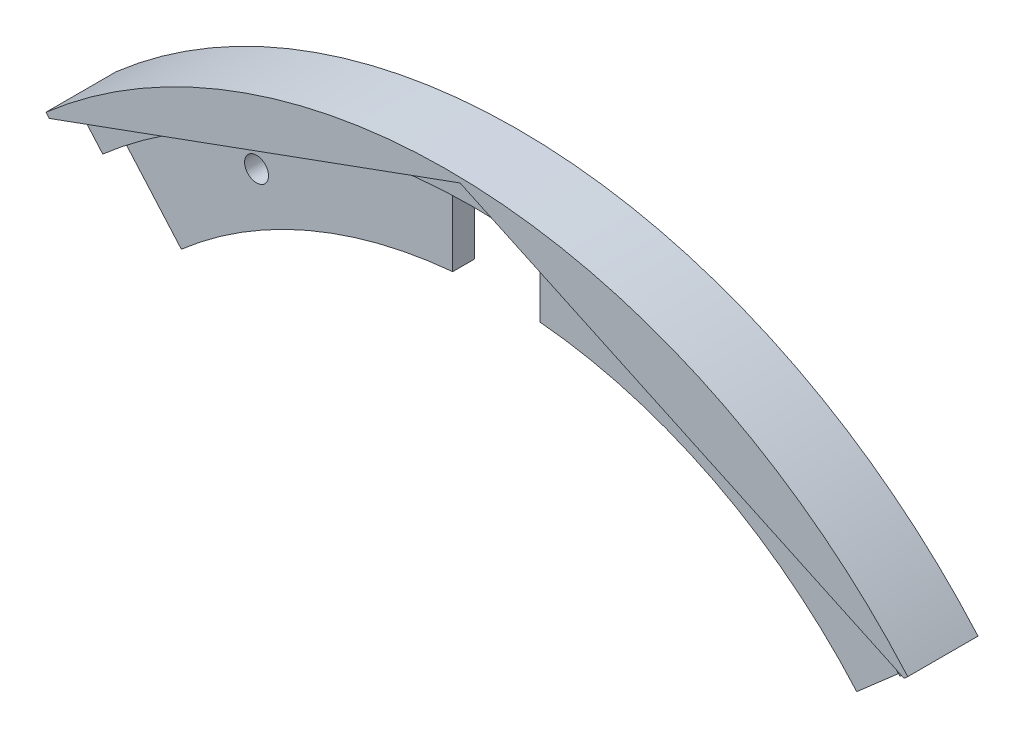
ISO-10303-21;
HEADER;
FILE_DESCRIPTION(('STEP AP214'),'2;1');
FILE_NAME('part.step','',(''),(''),'','','');
FILE_SCHEMA(('AUTOMOTIVE_DESIGN { 1 0 10303 214 1 1 1 1 }'));
ENDSEC;
DATA;
#1=APPLICATION_CONTEXT('core data for automotive mechanical design processes');
#2=APPLICATION_PROTOCOL_DEFINITION('international standard','automotive_design',2000,#1);
#3=PRODUCT_CONTEXT('',#1,'mechanical');
#4=PRODUCT('Part','Part','',(#3));
#5=PRODUCT_RELATED_PRODUCT_CATEGORY('part','',(#4));
#6=PRODUCT_DEFINITION_FORMATION('','',#4);
#7=PRODUCT_DEFINITION_CONTEXT('part definition',#1,'design');
#8=PRODUCT_DEFINITION('design','',#6,#7);
#9=PRODUCT_DEFINITION_SHAPE('','',#8);
#10=(LENGTH_UNIT() NAMED_UNIT(*) SI_UNIT(.MILLI.,.METRE.));
#11=(NAMED_UNIT(*) PLANE_ANGLE_UNIT() SI_UNIT($,.RADIAN.));
#12=(NAMED_UNIT(*) SI_UNIT($,.STERADIAN.) SOLID_ANGLE_UNIT());
#13=UNCERTAINTY_MEASURE_WITH_UNIT(LENGTH_MEASURE(1.E-05),#10,'distance_accuracy_value','');
#14=(GEOMETRIC_REPRESENTATION_CONTEXT(3) GLOBAL_UNCERTAINTY_ASSIGNED_CONTEXT((#13)) GLOBAL_UNIT_ASSIGNED_CONTEXT((#10,
#11,#12)) REPRESENTATION_CONTEXT('',''));
#15=CARTESIAN_POINT('',(0.,0.,0.));
#16=DIRECTION('',(0.,0.,1.));
#17=DIRECTION('',(1.,0.,0.));
#18=AXIS2_PLACEMENT_3D('',#15,#16,#17);
#19=CARTESIAN_POINT('',(0.,0.,-5.));
#20=DIRECTION('',(0.,0.,1.));
#21=DIRECTION('',(1.,0.,0.));
#22=AXIS2_PLACEMENT_3D('',#19,#20,#21);
#23=PLANE('',#22);
#24=DIRECTION('',(0.,-1.,0.));
#25=VECTOR('',#24,1.);
#26=CARTESIAN_POINT('',(-9.99999999999999,129.5,-5.));
#27=LINE('',#26,#25);
#28=CARTESIAN_POINT('',(-9.99999999999999,129.5,-5.));
#29=VERTEX_POINT('',#28);
#30=CARTESIAN_POINT('',(-9.99999999999999,129.113322318032,-5.));
#31=VERTEX_POINT('',#30);
#32=EDGE_CURVE('E56',#29,#31,#27,.T.);
#33=ORIENTED_EDGE('',*,*,#32,.F.);
#34=DIRECTION('',(-1.,0.,0.));
#35=VECTOR('',#34,1.);
#36=CARTESIAN_POINT('',(10.,129.5,-5.));
#37=LINE('',#36,#35);
#38=CARTESIAN_POINT('',(0.,129.5,-5.));
#39=VERTEX_POINT('',#38);
#40=EDGE_CURVE('E11',#39,#29,#37,.T.);
#41=ORIENTED_EDGE('',*,*,#40,.F.);
#42=CARTESIAN_POINT('',(0.,0.,-5.));
#43=DIRECTION('',(0.,0.,-1.));
#44=DIRECTION('',(1.,0.,0.));
#45=AXIS2_PLACEMENT_3D('',#42,#43,#44);
#46=CIRCLE('',#45,129.5);
#47=EDGE_CURVE('E241',#31,#39,#46,.T.);
#48=ORIENTED_EDGE('',*,*,#47,.F.);
#49=EDGE_LOOP('',(#33,#41,#48));
#50=FACE_BOUND('',#49,.T.);
#51=ADVANCED_FACE('F38',(#50),#23,.F.);
#52=CARTESIAN_POINT('',(10.,129.5,-5.));
#53=VERTEX_POINT('',#52);
#54=EDGE_CURVE('E49',#53,#39,#37,.T.);
#55=ORIENTED_EDGE('',*,*,#54,.F.);
#56=DIRECTION('',(0.,1.,0.));
#57=VECTOR('',#56,1.);
#58=CARTESIAN_POINT('',(10.,129.5,-5.));
#59=LINE('',#58,#57);
#60=CARTESIAN_POINT('',(10.,129.113322318032,-5.));
#61=VERTEX_POINT('',#60);
#62=EDGE_CURVE('E47',#61,#53,#59,.T.);
#63=ORIENTED_EDGE('',*,*,#62,.F.);
#64=EDGE_CURVE('E356',#39,#61,#46,.T.);
#65=ORIENTED_EDGE('',*,*,#64,.F.);
#66=EDGE_LOOP('',(#55,#63,#65));
#67=FACE_BOUND('',#66,.T.);
#68=ADVANCED_FACE('F357',(#67),#23,.F.);
#69=CARTESIAN_POINT('',(0.,0.,6.1));
#70=DIRECTION('',(-0.658059665220939,0.752965787409565,0.));
#71=DIRECTION('',(-0.752965787409565,-0.658059665220939,0.));
#72=AXIS2_PLACEMENT_3D('',#69,#70,#71);
#73=PLANE('',#72);
#74=DIRECTION('',(0.,0.,-1.));
#75=VECTOR('',#74,1.);
#76=CARTESIAN_POINT('',(104.553233239864,91.3750223636218,6.1));
#77=LINE('',#76,#75);
#78=CARTESIAN_POINT('',(104.553233239864,91.3750223636218,6.1));
#79=VERTEX_POINT('',#78);
#80=CARTESIAN_POINT('',(104.553233239864,91.3750223636218,0.));
#81=VERTEX_POINT('',#80);
#82=EDGE_CURVE('E278',#79,#81,#77,.T.);
#83=ORIENTED_EDGE('',*,*,#82,.T.);
#84=DIRECTION('',(0.752965787409557,0.658059665220947,0.));
#85=VECTOR('',#84,1.);
#86=CARTESIAN_POINT('',(97.5090694695387,85.2187266461115,0.));
#87=LINE('',#86,#85);
#88=CARTESIAN_POINT('',(97.5090694695387,85.2187266461115,0.));
#89=VERTEX_POINT('',#88);
#90=EDGE_CURVE('E247',#89,#81,#87,.T.);
#91=ORIENTED_EDGE('',*,*,#90,.F.);
#92=DIRECTION('',(0.,0.,1.));
#93=VECTOR('',#92,1.);
#94=CARTESIAN_POINT('',(97.5090694695387,85.2187266461115,-5.));
#95=LINE('',#94,#93);
#96=CARTESIAN_POINT('',(97.5090694695387,85.2187266461115,-5.));
#97=VERTEX_POINT('',#96);
#98=EDGE_CURVE('E244',#97,#89,#95,.T.);
#99=ORIENTED_EDGE('',*,*,#98,.F.);
#100=DIRECTION('',(-0.752965787409557,-0.658059665220948,0.));
#101=VECTOR('',#100,1.);
#102=CARTESIAN_POINT('',(82.6191710235147,72.2055967663673,-5.));
#103=LINE('',#102,#101);
#104=CARTESIAN_POINT('',(82.6191710235147,72.2055967663673,-5.));
#105=VERTEX_POINT('',#104);
#106=EDGE_CURVE('E204',#97,#105,#103,.T.);
#107=ORIENTED_EDGE('',*,*,#106,.T.);
#108=DIRECTION('',(0.,0.,1.));
#109=VECTOR('',#108,1.);
#110=CARTESIAN_POINT('',(82.6191710235147,72.2055967663673,-10.));
#111=LINE('',#110,#109);
#112=CARTESIAN_POINT('',(82.6191710235147,72.2055967663673,-10.));
#113=VERTEX_POINT('',#112);
#114=EDGE_CURVE('E174',#113,#105,#111,.T.);
#115=ORIENTED_EDGE('',*,*,#114,.F.);
#116=DIRECTION('',(-0.752965787409557,-0.658059665220948,0.));
#117=VECTOR('',#116,1.);
#118=CARTESIAN_POINT('',(82.6191710235147,72.2055967663673,-10.));
#119=LINE('',#118,#117);
#120=CARTESIAN_POINT('',(105.415210237339,92.1283531309317,-10.));
#121=VERTEX_POINT('',#120);
#122=EDGE_CURVE('E171',#121,#113,#119,.T.);
#123=ORIENTED_EDGE('',*,*,#122,.F.);
#124=DIRECTION('',(0.,0.,-1.));
#125=VECTOR('',#124,1.);
#126=CARTESIAN_POINT('',(105.415210237339,92.1283531309317,6.1));
#127=LINE('',#126,#125);
#128=CARTESIAN_POINT('',(105.415210237339,92.1283531309317,6.1));
#129=VERTEX_POINT('',#128);
#130=EDGE_CURVE('E159',#129,#121,#127,.T.);
#131=ORIENTED_EDGE('',*,*,#130,.F.);
#132=DIRECTION('',(0.752965787409565,0.658059665220939,0.));
#133=VECTOR('',#132,1.);
#134=CARTESIAN_POINT('',(0.,0.,6.1));
#135=LINE('',#134,#133);
#136=EDGE_CURVE('E266',#79,#129,#135,.T.);
#137=ORIENTED_EDGE('',*,*,#136,.F.);
#138=EDGE_LOOP('',(#83,#91,#99,#107,#115,#123,#131,#137));
#139=FACE_BOUND('',#138,.T.);
#140=ADVANCED_FACE('F40',(#139),#73,.F.);
#141=CARTESIAN_POINT('',(0.,0.,6.1));
#142=DIRECTION('',(0.,0.,-1.));
#143=DIRECTION('',(-1.,0.,0.));
#144=AXIS2_PLACEMENT_3D('',#141,#142,#143);
#145=CYLINDRICAL_SURFACE('',#144,140.);
#146=ORIENTED_EDGE('',*,*,#130,.T.);
#147=CARTESIAN_POINT('',(0.,0.,-10.));
#148=DIRECTION('',(0.,0.,-1.));
#149=DIRECTION('',(-1.,0.,0.));
#150=AXIS2_PLACEMENT_3D('',#147,#148,#149);
#151=CIRCLE('',#150,140.000000000001);
#152=CARTESIAN_POINT('',(-92.1283531309334,105.415210237339,-10.));
#153=VERTEX_POINT('',#152);
#154=EDGE_CURVE('E164',#153,#121,#151,.T.);
#155=ORIENTED_EDGE('',*,*,#154,.F.);
#156=DIRECTION('',(0.,0.,-1.));
#157=VECTOR('',#156,1.);
#158=CARTESIAN_POINT('',(-92.1283531309338,105.415210237339,6.1));
#159=LINE('',#158,#157);
#160=CARTESIAN_POINT('',(-92.1283531309338,105.415210237339,6.1));
#161=VERTEX_POINT('',#160);
#162=EDGE_CURVE('E169',#161,#153,#159,.T.);
#163=ORIENTED_EDGE('',*,*,#162,.F.);
#164=CARTESIAN_POINT('',(0.,0.,6.1));
#165=DIRECTION('',(0.,0.,1.));
#166=DIRECTION('',(1.,0.,0.));
#167=AXIS2_PLACEMENT_3D('',#164,#165,#166);
#168=CIRCLE('',#167,140.);
#169=EDGE_CURVE('E165',#129,#161,#168,.T.);
#170=ORIENTED_EDGE('',*,*,#169,.F.);
#171=EDGE_LOOP('',(#146,#155,#163,#170));
#172=FACE_BOUND('',#171,.T.);
#173=ADVANCED_FACE('F161',(#172),#145,.T.);
#174=CARTESIAN_POINT('',(0.,0.,6.1));
#175=DIRECTION('',(-0.752965787409557,-0.658059665220947,0.));
#176=DIRECTION('',(0.658059665220947,-0.752965787409557,0.));
#177=AXIS2_PLACEMENT_3D('',#174,#175,#176);
#178=PLANE('',#177);
#179=ORIENTED_EDGE('',*,*,#162,.T.);
#180=DIRECTION('',(-0.658059665220947,0.752965787409557,0.));
#181=VECTOR('',#180,1.);
#182=CARTESIAN_POINT('',(-92.1283531309334,105.415210237339,-10.));
#183=LINE('',#182,#181);
#184=CARTESIAN_POINT('',(-72.2055967663685,82.6191710235136,-10.));
#185=VERTEX_POINT('',#184);
#186=EDGE_CURVE('E183',#185,#153,#183,.T.);
#187=ORIENTED_EDGE('',*,*,#186,.F.);
#188=DIRECTION('',(0.,0.,1.));
#189=VECTOR('',#188,1.);
#190=CARTESIAN_POINT('',(-72.2055967663685,82.6191710235136,-10.));
#191=LINE('',#190,#189);
#192=CARTESIAN_POINT('',(-72.2055967663685,82.6191710235136,-5.));
#193=VERTEX_POINT('',#192);
#194=EDGE_CURVE('E203',#185,#193,#191,.T.);
#195=ORIENTED_EDGE('',*,*,#194,.T.);
#196=DIRECTION('',(-0.658059665220947,0.752965787409557,0.));
#197=VECTOR('',#196,1.);
#198=CARTESIAN_POINT('',(-92.1283531309334,105.415210237339,-5.));
#199=LINE('',#198,#197);
#200=CARTESIAN_POINT('',(-85.2187266461127,97.5090694695377,-5.));
#201=VERTEX_POINT('',#200);
#202=EDGE_CURVE('E184',#193,#201,#199,.T.);
#203=ORIENTED_EDGE('',*,*,#202,.T.);
#204=DIRECTION('',(0.,0.,1.));
#205=VECTOR('',#204,1.);
#206=CARTESIAN_POINT('',(-85.2187266461127,97.5090694695377,-5.));
#207=LINE('',#206,#205);
#208=CARTESIAN_POINT('',(-85.2187266461127,97.5090694695377,0.));
#209=VERTEX_POINT('',#208);
#210=EDGE_CURVE('E262',#201,#209,#207,.T.);
#211=ORIENTED_EDGE('',*,*,#210,.T.);
#212=DIRECTION('',(0.658059665220947,-0.752965787409557,0.));
#213=VECTOR('',#212,1.);
#214=CARTESIAN_POINT('',(-92.1283531309338,105.415210237339,0.));
#215=LINE('',#214,#213);
#216=CARTESIAN_POINT('',(-91.3750223636239,104.553233239863,0.));
#217=VERTEX_POINT('',#216);
#218=EDGE_CURVE('E250',#217,#209,#215,.T.);
#219=ORIENTED_EDGE('',*,*,#218,.F.);
#220=DIRECTION('',(0.,0.,-1.));
#221=VECTOR('',#220,1.);
#222=CARTESIAN_POINT('',(-91.3750223636219,104.553233239864,6.1));
#223=LINE('',#222,#221);
#224=CARTESIAN_POINT('',(-91.3750223636219,104.553233239864,6.1));
#225=VERTEX_POINT('',#224);
#226=EDGE_CURVE('E287',#225,#217,#223,.T.);
#227=ORIENTED_EDGE('',*,*,#226,.F.);
#228=DIRECTION('',(-0.658059665220947,0.752965787409557,0.));
#229=VECTOR('',#228,1.);
#230=CARTESIAN_POINT('',(0.,0.,6.1));
#231=LINE('',#230,#229);
#232=EDGE_CURVE('E270',#225,#161,#231,.T.);
#233=ORIENTED_EDGE('',*,*,#232,.T.);
#234=EDGE_LOOP('',(#179,#187,#195,#203,#211,#219,#227,#233));
#235=FACE_BOUND('',#234,.T.);
#236=ADVANCED_FACE('F290',(#235),#178,.T.);
#237=CARTESIAN_POINT('',(-44.2916085606737,121.690194391775,6.1));
#238=DIRECTION('',(0.342020143325665,-0.939692620785909,0.));
#239=DIRECTION('',(0.93969262078591,0.342020143325665,0.));
#240=AXIS2_PLACEMENT_3D('',#237,#238,#239);
#241=PLANE('',#240);
#242=DIRECTION('',(-0.93969262078591,-0.342020143325665,0.));
#243=VECTOR('',#242,1.);
#244=CARTESIAN_POINT('',(-44.2916085606737,121.690194391775,0.));
#245=LINE('',#244,#243);
#246=CARTESIAN_POINT('',(2.79180524227468,138.827155543687,0.));
#247=VERTEX_POINT('',#246);
#248=CARTESIAN_POINT('',(-44.2916085606737,121.690194391775,0.));
#249=VERTEX_POINT('',#248);
#250=EDGE_CURVE('E279',#247,#249,#245,.T.);
#251=ORIENTED_EDGE('',*,*,#250,.F.);
#252=DIRECTION('',(0.,0.,-1.));
#253=VECTOR('',#252,1.);
#254=CARTESIAN_POINT('',(2.79180524227468,138.827155543687,6.1));
#255=LINE('',#254,#253);
#256=CARTESIAN_POINT('',(2.79180524227468,138.827155543687,6.1));
#257=VERTEX_POINT('',#256);
#258=EDGE_CURVE('E285',#257,#247,#255,.T.);
#259=ORIENTED_EDGE('',*,*,#258,.F.);
#260=DIRECTION('',(-0.93969262078591,-0.342020143325665,0.));
#261=VECTOR('',#260,1.);
#262=CARTESIAN_POINT('',(-44.2916085606737,121.690194391775,6.1));
#263=LINE('',#262,#261);
#264=EDGE_CURVE('E273',#257,#225,#263,.T.);
#265=ORIENTED_EDGE('',*,*,#264,.T.);
#266=ORIENTED_EDGE('',*,*,#226,.T.);
#267=EDGE_CURVE('E258',#249,#217,#245,.T.);
#268=ORIENTED_EDGE('',*,*,#267,.F.);
#269=EDGE_LOOP('',(#251,#259,#265,#266,#268));
#270=FACE_BOUND('',#269,.T.);
#271=ADVANCED_FACE('F298',(#270),#241,.T.);
#272=CARTESIAN_POINT('',(53.6725192410694,115.101088953654,6.1));
#273=DIRECTION('',(0.422618261740704,0.906307787036648,0.));
#274=DIRECTION('',(-0.906307787036648,0.422618261740704,0.));
#275=AXIS2_PLACEMENT_3D('',#272,#273,#274);
#276=PLANE('',#275);
#277=DIRECTION('',(0.906307787036648,-0.422618261740704,0.));
#278=VECTOR('',#277,1.);
#279=CARTESIAN_POINT('',(53.6725192410694,115.101088953654,0.));
#280=LINE('',#279,#278);
#281=CARTESIAN_POINT('',(30.7221646173224,125.803015072081,0.));
#282=VERTEX_POINT('',#281);
#283=EDGE_CURVE('E268',#247,#282,#280,.T.);
#284=ORIENTED_EDGE('',*,*,#283,.T.);
#285=DIRECTION('',(0.,0.,1.));
#286=VECTOR('',#285,1.);
#287=CARTESIAN_POINT('',(30.7221646173224,125.803015072081,-5.));
#288=LINE('',#287,#286);
#289=CARTESIAN_POINT('',(30.7221646173224,125.803015072081,-5.));
#290=VERTEX_POINT('',#289);
#291=EDGE_CURVE('E259',#290,#282,#288,.T.);
#292=ORIENTED_EDGE('',*,*,#291,.F.);
#293=DIRECTION('',(0.906307787036648,-0.422618261740703,0.));
#294=VECTOR('',#293,1.);
#295=CARTESIAN_POINT('',(30.7221646173224,125.803015072081,-5.));
#296=LINE('',#295,#294);
#297=CARTESIAN_POINT('',(76.6228738648163,104.399162835228,-5.));
#298=VERTEX_POINT('',#297);
#299=EDGE_CURVE('E240',#290,#298,#296,.T.);
#300=ORIENTED_EDGE('',*,*,#299,.T.);
#301=DIRECTION('',(0.,0.,1.));
#302=VECTOR('',#301,1.);
#303=CARTESIAN_POINT('',(76.6228738648163,104.399162835228,-5.));
#304=LINE('',#303,#302);
#305=CARTESIAN_POINT('',(76.6228738648164,104.399162835228,0.));
#306=VERTEX_POINT('',#305);
#307=EDGE_CURVE('E255',#298,#306,#304,.T.);
#308=ORIENTED_EDGE('',*,*,#307,.T.);
#309=EDGE_CURVE('E282',#306,#81,#280,.T.);
#310=ORIENTED_EDGE('',*,*,#309,.T.);
#311=ORIENTED_EDGE('',*,*,#82,.F.);
#312=DIRECTION('',(0.906307787036648,-0.422618261740704,0.));
#313=VECTOR('',#312,1.);
#314=CARTESIAN_POINT('',(53.6725192410694,115.101088953654,6.1));
#315=LINE('',#314,#313);
#316=EDGE_CURVE('E276',#257,#79,#315,.T.);
#317=ORIENTED_EDGE('',*,*,#316,.F.);
#318=ORIENTED_EDGE('',*,*,#258,.T.);
#319=EDGE_LOOP('',(#284,#292,#300,#308,#310,#311,#317,#318));
#320=FACE_BOUND('',#319,.T.);
#321=ADVANCED_FACE('F304',(#320),#276,.F.);
#322=CARTESIAN_POINT('',(0.,0.,6.1));
#323=DIRECTION('',(0.,0.,1.));
#324=DIRECTION('',(1.,0.,0.));
#325=AXIS2_PLACEMENT_3D('',#322,#323,#324);
#326=PLANE('',#325);
#327=ORIENTED_EDGE('',*,*,#136,.T.);
#328=ORIENTED_EDGE('',*,*,#169,.T.);
#329=ORIENTED_EDGE('',*,*,#232,.F.);
#330=ORIENTED_EDGE('',*,*,#264,.F.);
#331=ORIENTED_EDGE('',*,*,#316,.T.);
#332=EDGE_LOOP('',(#327,#328,#329,#330,#331));
#333=FACE_BOUND('',#332,.T.);
#334=ADVANCED_FACE('F295',(#333),#326,.T.);
#335=CARTESIAN_POINT('',(0.,0.,0.));
#336=DIRECTION('',(0.,0.,1.));
#337=DIRECTION('',(1.,0.,0.));
#338=AXIS2_PLACEMENT_3D('',#335,#336,#337);
#339=PLANE('',#338);
#340=ORIENTED_EDGE('',*,*,#309,.F.);
#341=CARTESIAN_POINT('',(0.,0.,0.));
#342=DIRECTION('',(0.,0.,-1.));
#343=DIRECTION('',(1.,0.,0.));
#344=AXIS2_PLACEMENT_3D('',#341,#342,#343);
#345=CIRCLE('',#344,129.5);
#346=EDGE_CURVE('E231',#306,#89,#345,.T.);
#347=ORIENTED_EDGE('',*,*,#346,.T.);
#348=ORIENTED_EDGE('',*,*,#90,.T.);
#349=EDGE_LOOP('',(#340,#347,#348));
#350=FACE_BOUND('',#349,.T.);
#351=ADVANCED_FACE('F307',(#350),#339,.T.);
#352=ORIENTED_EDGE('',*,*,#283,.F.);
#353=ORIENTED_EDGE('',*,*,#250,.T.);
#354=CARTESIAN_POINT('',(0.,0.,0.));
#355=DIRECTION('',(0.,0.,-1.));
#356=DIRECTION('',(1.,0.,0.));
#357=AXIS2_PLACEMENT_3D('',#354,#355,#356);
#358=CIRCLE('',#357,129.5);
#359=EDGE_CURVE('E252',#249,#282,#358,.T.);
#360=ORIENTED_EDGE('',*,*,#359,.T.);
#361=EDGE_LOOP('',(#352,#353,#360));
#362=FACE_BOUND('',#361,.T.);
#363=ADVANCED_FACE('F354',(#362),#339,.T.);
#364=CARTESIAN_POINT('',(0.,0.,-5.));
#365=DIRECTION('',(0.,0.,1.));
#366=DIRECTION('',(1.,0.,0.));
#367=AXIS2_PLACEMENT_3D('',#364,#365,#366);
#368=CYLINDRICAL_SURFACE('',#367,129.5);
#369=ORIENTED_EDGE('',*,*,#346,.F.);
#370=ORIENTED_EDGE('',*,*,#307,.F.);
#371=CARTESIAN_POINT('',(0.,0.,-5.));
#372=DIRECTION('',(0.,0.,-1.));
#373=DIRECTION('',(1.,0.,0.));
#374=AXIS2_PLACEMENT_3D('',#371,#372,#373);
#375=CIRCLE('',#374,129.5);
#376=EDGE_CURVE('E232',#298,#97,#375,.T.);
#377=ORIENTED_EDGE('',*,*,#376,.T.);
#378=ORIENTED_EDGE('',*,*,#98,.T.);
#379=EDGE_LOOP('',(#369,#370,#377,#378));
#380=FACE_BOUND('',#379,.T.);
#381=ADVANCED_FACE('F310',(#380),#368,.F.);
#382=CARTESIAN_POINT('',(0.,0.,-5.));
#383=DIRECTION('',(0.,0.,1.));
#384=DIRECTION('',(1.,0.,0.));
#385=AXIS2_PLACEMENT_3D('',#382,#383,#384);
#386=CYLINDRICAL_SURFACE('',#385,129.5);
#387=EDGE_CURVE('E236',#209,#249,#358,.T.);
#388=ORIENTED_EDGE('',*,*,#387,.F.);
#389=ORIENTED_EDGE('',*,*,#210,.F.);
#390=EDGE_CURVE('E237',#201,#31,#46,.T.);
#391=ORIENTED_EDGE('',*,*,#390,.T.);
#392=ORIENTED_EDGE('',*,*,#47,.T.);
#393=ORIENTED_EDGE('',*,*,#64,.T.);
#394=EDGE_CURVE('E235',#61,#290,#46,.T.);
#395=ORIENTED_EDGE('',*,*,#394,.T.);
#396=ORIENTED_EDGE('',*,*,#291,.T.);
#397=ORIENTED_EDGE('',*,*,#359,.F.);
#398=EDGE_LOOP('',(#388,#389,#391,#392,#393,#395,#396,#397));
#399=FACE_BOUND('',#398,.T.);
#400=ADVANCED_FACE('F348',(#399),#386,.F.);
#401=ORIENTED_EDGE('',*,*,#387,.T.);
#402=ORIENTED_EDGE('',*,*,#267,.T.);
#403=ORIENTED_EDGE('',*,*,#218,.T.);
#404=EDGE_LOOP('',(#401,#402,#403));
#405=FACE_BOUND('',#404,.T.);
#406=ADVANCED_FACE('F351',(#405),#339,.T.);
#407=CARTESIAN_POINT('',(0.,0.,-5.));
#408=DIRECTION('',(0.,0.,-1.));
#409=DIRECTION('',(-1.,0.,0.));
#410=AXIS2_PLACEMENT_3D('',#407,#408,#409);
#411=PLANE('',#410);
#412=ORIENTED_EDGE('',*,*,#390,.F.);
#413=ORIENTED_EDGE('',*,*,#202,.F.);
#414=CARTESIAN_POINT('',(0.,0.,-5.));
#415=DIRECTION('',(0.,0.,1.));
#416=DIRECTION('',(-1.,0.,0.));
#417=AXIS2_PLACEMENT_3D('',#414,#415,#416);
#418=CIRCLE('',#417,109.725);
#419=CARTESIAN_POINT('',(-9.99999999999999,109.268365161194,-5.));
#420=VERTEX_POINT('',#419);
#421=EDGE_CURVE('E187',#420,#193,#418,.T.);
#422=ORIENTED_EDGE('',*,*,#421,.F.);
#423=EDGE_CURVE('E213',#31,#420,#27,.T.);
#424=ORIENTED_EDGE('',*,*,#423,.F.);
#425=EDGE_LOOP('',(#412,#413,#422,#424));
#426=FACE_BOUND('',#425,.T.);
#427=CARTESIAN_POINT('',(-54.9667964392054,107.162966034031,-5.));
#428=DIRECTION('',(0.,0.,-1.));
#429=DIRECTION('',(-1.,0.,0.));
#430=AXIS2_PLACEMENT_3D('',#427,#428,#429);
#431=CIRCLE('',#430,2.75);
#432=CARTESIAN_POINT('',(-57.7167964392054,107.162966034031,-5.));
#433=VERTEX_POINT('',#432);
#434=EDGE_CURVE('E190',#433,#433,#431,.T.);
#435=ORIENTED_EDGE('',*,*,#434,.T.);
#436=EDGE_LOOP('',(#435));
#437=FACE_BOUND('',#436,.T.);
#438=ADVANCED_FACE('F343',(#426,#437),#411,.F.);
#439=CARTESIAN_POINT('',(0.,0.,-10.));
#440=DIRECTION('',(0.,0.,-1.));
#441=DIRECTION('',(-1.,0.,0.));
#442=AXIS2_PLACEMENT_3D('',#439,#440,#441);
#443=PLANE('',#442);
#444=CARTESIAN_POINT('',(76.8131193575413,91.542310952718,-10.));
#445=DIRECTION('',(0.,0.,1.));
#446=DIRECTION('',(1.,0.,0.));
#447=AXIS2_PLACEMENT_3D('',#444,#445,#446);
#448=CIRCLE('',#447,2.75000000000001);
#449=CARTESIAN_POINT('',(79.5631193575413,91.542310952718,-10.));
#450=VERTEX_POINT('',#449);
#451=EDGE_CURVE('E569',#450,#450,#448,.T.);
#452=ORIENTED_EDGE('',*,*,#451,.T.);
#453=EDGE_LOOP('',(#452));
#454=FACE_BOUND('',#453,.T.);
#455=ORIENTED_EDGE('',*,*,#154,.T.);
#456=ORIENTED_EDGE('',*,*,#122,.T.);
#457=CARTESIAN_POINT('',(0.,0.,-10.));
#458=DIRECTION('',(0.,0.,1.));
#459=DIRECTION('',(-1.,0.,0.));
#460=AXIS2_PLACEMENT_3D('',#457,#458,#459);
#461=CIRCLE('',#460,109.725);
#462=CARTESIAN_POINT('',(10.,109.268365161194,-10.));
#463=VERTEX_POINT('',#462);
#464=EDGE_CURVE('E177',#113,#463,#461,.T.);
#465=ORIENTED_EDGE('',*,*,#464,.T.);
#466=DIRECTION('',(0.,1.,0.));
#467=VECTOR('',#466,1.);
#468=CARTESIAN_POINT('',(10.,129.5,-10.));
#469=LINE('',#468,#467);
#470=CARTESIAN_POINT('',(10.,129.5,-10.));
#471=VERTEX_POINT('',#470);
#472=EDGE_CURVE('E194',#463,#471,#469,.T.);
#473=ORIENTED_EDGE('',*,*,#472,.T.);
#474=DIRECTION('',(-1.,0.,0.));
#475=VECTOR('',#474,1.);
#476=CARTESIAN_POINT('',(10.,129.5,-10.));
#477=LINE('',#476,#475);
#478=CARTESIAN_POINT('',(-9.99999999999999,129.5,-10.));
#479=VERTEX_POINT('',#478);
#480=EDGE_CURVE('E196',#471,#479,#477,.T.);
#481=ORIENTED_EDGE('',*,*,#480,.T.);
#482=DIRECTION('',(0.,-1.,0.));
#483=VECTOR('',#482,1.);
#484=CARTESIAN_POINT('',(-9.99999999999999,129.5,-10.));
#485=LINE('',#484,#483);
#486=CARTESIAN_POINT('',(-9.99999999999999,109.268365161194,-10.));
#487=VERTEX_POINT('',#486);
#488=EDGE_CURVE('E198',#479,#487,#485,.T.);
#489=ORIENTED_EDGE('',*,*,#488,.T.);
#490=CARTESIAN_POINT('',(0.,0.,-10.));
#491=DIRECTION('',(0.,0.,1.));
#492=DIRECTION('',(-1.,0.,0.));
#493=AXIS2_PLACEMENT_3D('',#490,#491,#492);
#494=CIRCLE('',#493,109.725);
#495=EDGE_CURVE('E200',#487,#185,#494,.T.);
#496=ORIENTED_EDGE('',*,*,#495,.T.);
#497=ORIENTED_EDGE('',*,*,#186,.T.);
#498=EDGE_LOOP('',(#455,#456,#465,#473,#481,#489,#496,#497));
#499=FACE_BOUND('',#498,.T.);
#500=CARTESIAN_POINT('',(-54.9667964392054,107.162966034031,-10.));
#501=DIRECTION('',(0.,0.,-1.));
#502=DIRECTION('',(-1.,0.,0.));
#503=AXIS2_PLACEMENT_3D('',#500,#501,#502);
#504=CIRCLE('',#503,2.75);
#505=CARTESIAN_POINT('',(-57.7167964392054,107.162966034031,-10.));
#506=VERTEX_POINT('',#505);
#507=EDGE_CURVE('E207',#506,#506,#504,.T.);
#508=ORIENTED_EDGE('',*,*,#507,.F.);
#509=EDGE_LOOP('',(#508));
#510=FACE_BOUND('',#509,.T.);
#511=ADVANCED_FACE('F180',(#454,#499,#510),#443,.T.);
#512=CARTESIAN_POINT('',(76.8131193575413,91.542310952718,-5.));
#513=DIRECTION('',(0.,0.,-1.));
#514=DIRECTION('',(-1.,0.,0.));
#515=AXIS2_PLACEMENT_3D('',#512,#513,#514);
#516=CIRCLE('',#515,2.75000000000001);
#517=CARTESIAN_POINT('',(74.0631193575413,91.542310952718,-5.));
#518=VERTEX_POINT('',#517);
#519=EDGE_CURVE('E42',#518,#518,#516,.T.);
#520=ORIENTED_EDGE('',*,*,#519,.T.);
#521=EDGE_LOOP('',(#520));
#522=FACE_BOUND('',#521,.T.);
#523=ORIENTED_EDGE('',*,*,#376,.F.);
#524=ORIENTED_EDGE('',*,*,#299,.F.);
#525=ORIENTED_EDGE('',*,*,#394,.F.);
#526=CARTESIAN_POINT('',(10.,109.268365161194,-5.));
#527=VERTEX_POINT('',#526);
#528=EDGE_CURVE('E209',#527,#61,#59,.T.);
#529=ORIENTED_EDGE('',*,*,#528,.F.);
#530=CARTESIAN_POINT('',(0.,0.,-5.));
#531=DIRECTION('',(0.,0.,1.));
#532=DIRECTION('',(-1.,0.,0.));
#533=AXIS2_PLACEMENT_3D('',#530,#531,#532);
#534=CIRCLE('',#533,109.725);
#535=EDGE_CURVE('E206',#105,#527,#534,.T.);
#536=ORIENTED_EDGE('',*,*,#535,.F.);
#537=ORIENTED_EDGE('',*,*,#106,.F.);
#538=EDGE_LOOP('',(#523,#524,#525,#529,#536,#537));
#539=FACE_BOUND('',#538,.T.);
#540=ADVANCED_FACE('F319',(#522,#539),#411,.F.);
#541=CARTESIAN_POINT('',(0.,0.,-10.));
#542=DIRECTION('',(0.,0.,1.));
#543=DIRECTION('',(1.,0.,0.));
#544=AXIS2_PLACEMENT_3D('',#541,#542,#543);
#545=CYLINDRICAL_SURFACE('',#544,109.725);
#546=ORIENTED_EDGE('',*,*,#535,.T.);
#547=DIRECTION('',(0.,0.,1.));
#548=VECTOR('',#547,1.);
#549=CARTESIAN_POINT('',(10.,109.268365161194,-10.));
#550=LINE('',#549,#548);
#551=EDGE_CURVE('E227',#463,#527,#550,.T.);
#552=ORIENTED_EDGE('',*,*,#551,.F.);
#553=ORIENTED_EDGE('',*,*,#464,.F.);
#554=ORIENTED_EDGE('',*,*,#114,.T.);
#555=EDGE_LOOP('',(#546,#552,#553,#554));
#556=FACE_BOUND('',#555,.T.);
#557=ADVANCED_FACE('F316',(#556),#545,.F.);
#558=CARTESIAN_POINT('',(10.,129.5,-10.));
#559=DIRECTION('',(1.,0.,0.));
#560=DIRECTION('',(0.,0.,-1.));
#561=AXIS2_PLACEMENT_3D('',#558,#559,#560);
#562=PLANE('',#561);
#563=ORIENTED_EDGE('',*,*,#528,.T.);
#564=ORIENTED_EDGE('',*,*,#62,.T.);
#565=DIRECTION('',(0.,0.,1.));
#566=VECTOR('',#565,1.);
#567=CARTESIAN_POINT('',(10.,129.5,-10.));
#568=LINE('',#567,#566);
#569=EDGE_CURVE('E224',#471,#53,#568,.T.);
#570=ORIENTED_EDGE('',*,*,#569,.F.);
#571=ORIENTED_EDGE('',*,*,#472,.F.);
#572=ORIENTED_EDGE('',*,*,#551,.T.);
#573=EDGE_LOOP('',(#563,#564,#570,#571,#572));
#574=FACE_BOUND('',#573,.T.);
#575=ADVANCED_FACE('F323',(#574),#562,.F.);
#576=CARTESIAN_POINT('',(10.,129.5,-10.));
#577=DIRECTION('',(0.,1.,0.));
#578=DIRECTION('',(0.,0.,1.));
#579=AXIS2_PLACEMENT_3D('',#576,#577,#578);
#580=PLANE('',#579);
#581=ORIENTED_EDGE('',*,*,#54,.T.);
#582=ORIENTED_EDGE('',*,*,#40,.T.);
#583=DIRECTION('',(0.,0.,1.));
#584=VECTOR('',#583,1.);
#585=CARTESIAN_POINT('',(-9.99999999999999,129.5,-10.));
#586=LINE('',#585,#584);
#587=EDGE_CURVE('E221',#479,#29,#586,.T.);
#588=ORIENTED_EDGE('',*,*,#587,.F.);
#589=ORIENTED_EDGE('',*,*,#480,.F.);
#590=ORIENTED_EDGE('',*,*,#569,.T.);
#591=EDGE_LOOP('',(#581,#582,#588,#589,#590));
#592=FACE_BOUND('',#591,.T.);
#593=ADVANCED_FACE('F331',(#592),#580,.F.);
#594=CARTESIAN_POINT('',(-9.99999999999999,129.5,-10.));
#595=DIRECTION('',(-1.,0.,0.));
#596=DIRECTION('',(0.,0.,1.));
#597=AXIS2_PLACEMENT_3D('',#594,#595,#596);
#598=PLANE('',#597);
#599=ORIENTED_EDGE('',*,*,#32,.T.);
#600=ORIENTED_EDGE('',*,*,#423,.T.);
#601=DIRECTION('',(0.,0.,1.));
#602=VECTOR('',#601,1.);
#603=CARTESIAN_POINT('',(-9.99999999999999,109.268365161194,-10.));
#604=LINE('',#603,#602);
#605=EDGE_CURVE('E218',#487,#420,#604,.T.);
#606=ORIENTED_EDGE('',*,*,#605,.F.);
#607=ORIENTED_EDGE('',*,*,#488,.F.);
#608=ORIENTED_EDGE('',*,*,#587,.T.);
#609=EDGE_LOOP('',(#599,#600,#606,#607,#608));
#610=FACE_BOUND('',#609,.T.);
#611=ADVANCED_FACE('F333',(#610),#598,.F.);
#612=CARTESIAN_POINT('',(0.,0.,-10.));
#613=DIRECTION('',(0.,0.,1.));
#614=DIRECTION('',(1.,0.,0.));
#615=AXIS2_PLACEMENT_3D('',#612,#613,#614);
#616=CYLINDRICAL_SURFACE('',#615,109.725);
#617=ORIENTED_EDGE('',*,*,#421,.T.);
#618=ORIENTED_EDGE('',*,*,#194,.F.);
#619=ORIENTED_EDGE('',*,*,#495,.F.);
#620=ORIENTED_EDGE('',*,*,#605,.T.);
#621=EDGE_LOOP('',(#617,#618,#619,#620));
#622=FACE_BOUND('',#621,.T.);
#623=ADVANCED_FACE('F339',(#622),#616,.F.);
#624=CARTESIAN_POINT('',(-54.9667964392054,107.162966034031,-10.));
#625=DIRECTION('',(0.,0.,1.));
#626=DIRECTION('',(1.,0.,0.));
#627=AXIS2_PLACEMENT_3D('',#624,#625,#626);
#628=CYLINDRICAL_SURFACE('',#627,2.75);
#629=ORIENTED_EDGE('',*,*,#507,.T.);
#630=EDGE_LOOP('',(#629));
#631=FACE_BOUND('',#630,.T.);
#632=ORIENTED_EDGE('',*,*,#434,.F.);
#633=EDGE_LOOP('',(#632));
#634=FACE_BOUND('',#633,.T.);
#635=ADVANCED_FACE('F473',(#631,#634),#628,.F.);
#636=CARTESIAN_POINT('',(76.8131193575413,91.542310952718,-10.));
#637=DIRECTION('',(0.,0.,1.));
#638=DIRECTION('',(1.,0.,0.));
#639=AXIS2_PLACEMENT_3D('',#636,#637,#638);
#640=CYLINDRICAL_SURFACE('',#639,2.75000000000001);
#641=ORIENTED_EDGE('',*,*,#451,.F.);
#642=EDGE_LOOP('',(#641));
#643=FACE_BOUND('',#642,.T.);
#644=ORIENTED_EDGE('',*,*,#519,.F.);
#645=EDGE_LOOP('',(#644));
#646=FACE_BOUND('',#645,.T.);
#647=ADVANCED_FACE('F479',(#643,#646),#640,.F.);
#648=CLOSED_SHELL('',(#51,#68,#140,#173,#236,#271,#321,#334,#351,#363,#381,#400,#406,#438,#511,
#540,#557,#575,#593,#611,#623,#635,#647));
#649=MANIFOLD_SOLID_BREP('B2',#648);
#650=ADVANCED_BREP_SHAPE_REPRESENTATION('',(#18,#649),#14);
#651=SHAPE_DEFINITION_REPRESENTATION(#9,#650);
ENDSEC;
END-ISO-10303-21;
